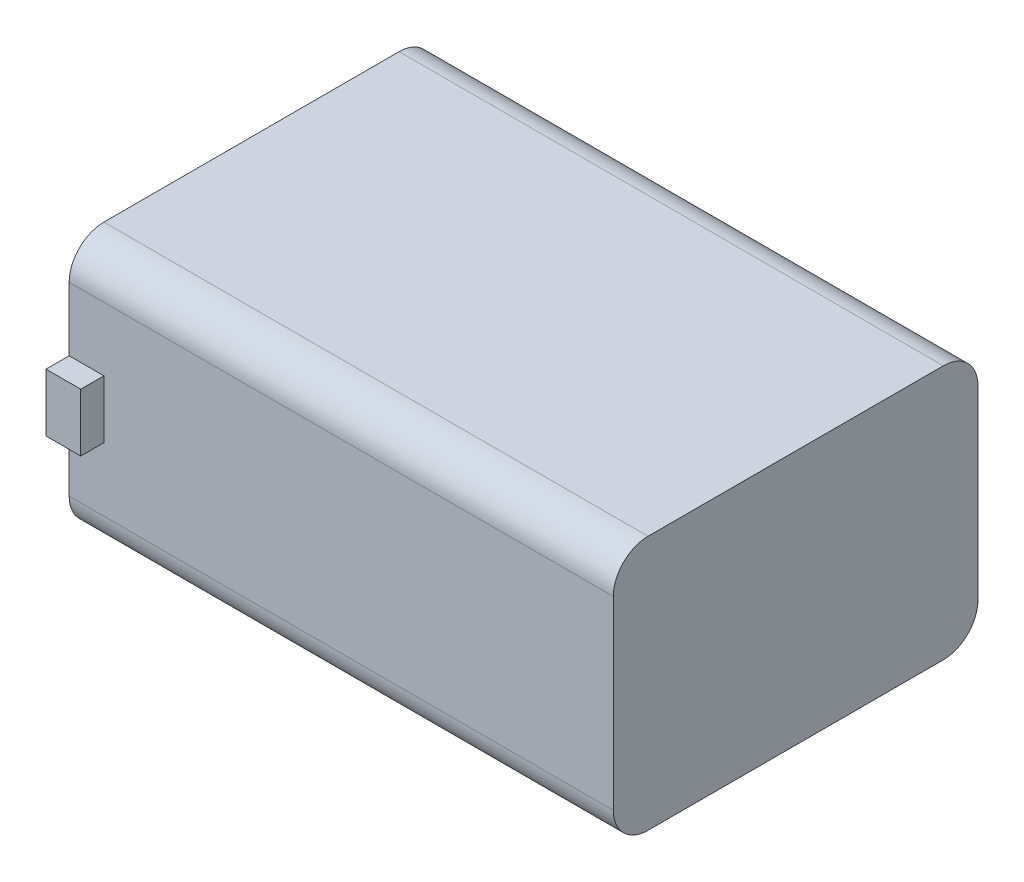
ISO-10303-21;
HEADER;
FILE_DESCRIPTION(('STEP AP214'),'2;1');
FILE_NAME('part.step','',(''),(''),'','','');
FILE_SCHEMA(('AUTOMOTIVE_DESIGN { 1 0 10303 214 1 1 1 1 }'));
ENDSEC;
DATA;
#1=APPLICATION_CONTEXT('core data for automotive mechanical design processes');
#2=APPLICATION_PROTOCOL_DEFINITION('international standard','automotive_design',2000,#1);
#3=PRODUCT_CONTEXT('',#1,'mechanical');
#4=PRODUCT('Part','Part','',(#3));
#5=PRODUCT_RELATED_PRODUCT_CATEGORY('part','',(#4));
#6=PRODUCT_DEFINITION_FORMATION('','',#4);
#7=PRODUCT_DEFINITION_CONTEXT('part definition',#1,'design');
#8=PRODUCT_DEFINITION('design','',#6,#7);
#9=PRODUCT_DEFINITION_SHAPE('','',#8);
#10=(LENGTH_UNIT() NAMED_UNIT(*) SI_UNIT(.MILLI.,.METRE.));
#11=(NAMED_UNIT(*) PLANE_ANGLE_UNIT() SI_UNIT($,.RADIAN.));
#12=(NAMED_UNIT(*) SI_UNIT($,.STERADIAN.) SOLID_ANGLE_UNIT());
#13=UNCERTAINTY_MEASURE_WITH_UNIT(LENGTH_MEASURE(1.E-05),#10,'distance_accuracy_value','');
#14=(GEOMETRIC_REPRESENTATION_CONTEXT(3) GLOBAL_UNCERTAINTY_ASSIGNED_CONTEXT((#13)) GLOBAL_UNIT_ASSIGNED_CONTEXT((#10,
#11,#12)) REPRESENTATION_CONTEXT('',''));
#15=CARTESIAN_POINT('',(0.,0.,0.));
#16=DIRECTION('',(0.,0.,1.));
#17=DIRECTION('',(1.,0.,0.));
#18=AXIS2_PLACEMENT_3D('',#15,#16,#17);
#19=CARTESIAN_POINT('',(23.5,11.,-15.75));
#20=DIRECTION('',(-1.,0.,0.));
#21=DIRECTION('',(0.,0.,1.));
#22=AXIS2_PLACEMENT_3D('',#19,#20,#21);
#23=PLANE('',#22);
#24=DIRECTION('',(0.,0.,-1.));
#25=VECTOR('',#24,1.);
#26=CARTESIAN_POINT('',(23.5,11.,-15.75));
#27=LINE('',#26,#25);
#28=CARTESIAN_POINT('',(23.5,11.,12.75));
#29=VERTEX_POINT('',#28);
#30=CARTESIAN_POINT('',(23.5,11.,-12.75));
#31=VERTEX_POINT('',#30);
#32=EDGE_CURVE('E166',#29,#31,#27,.T.);
#33=ORIENTED_EDGE('',*,*,#32,.F.);
#34=CARTESIAN_POINT('',(23.5,8.,12.75));
#35=DIRECTION('',(-1.,0.,0.));
#36=DIRECTION('',(0.,0.,1.));
#37=AXIS2_PLACEMENT_3D('',#34,#35,#36);
#38=CIRCLE('',#37,3.);
#39=CARTESIAN_POINT('',(23.5,8.,15.75));
#40=VERTEX_POINT('',#39);
#41=EDGE_CURVE('E214',#29,#40,#38,.F.);
#42=ORIENTED_EDGE('',*,*,#41,.T.);
#43=DIRECTION('',(0.,-1.,0.));
#44=VECTOR('',#43,1.);
#45=CARTESIAN_POINT('',(23.5,11.,15.75));
#46=LINE('',#45,#44);
#47=CARTESIAN_POINT('',(23.5,-8.,15.75));
#48=VERTEX_POINT('',#47);
#49=EDGE_CURVE('E175',#40,#48,#46,.T.);
#50=ORIENTED_EDGE('',*,*,#49,.T.);
#51=CARTESIAN_POINT('',(23.5,-8.,12.75));
#52=DIRECTION('',(-1.,0.,0.));
#53=DIRECTION('',(0.,0.,1.));
#54=AXIS2_PLACEMENT_3D('',#51,#52,#53);
#55=CIRCLE('',#54,3.);
#56=CARTESIAN_POINT('',(23.5,-11.,12.75));
#57=VERTEX_POINT('',#56);
#58=EDGE_CURVE('E208',#48,#57,#55,.F.);
#59=ORIENTED_EDGE('',*,*,#58,.T.);
#60=DIRECTION('',(0.,0.,-1.));
#61=VECTOR('',#60,1.);
#62=CARTESIAN_POINT('',(23.5,-11.,-15.75));
#63=LINE('',#62,#61);
#64=CARTESIAN_POINT('',(23.5,-11.,-12.75));
#65=VERTEX_POINT('',#64);
#66=EDGE_CURVE('E164',#57,#65,#63,.T.);
#67=ORIENTED_EDGE('',*,*,#66,.T.);
#68=CARTESIAN_POINT('',(23.5,-8.,-12.75));
#69=DIRECTION('',(-1.,0.,0.));
#70=DIRECTION('',(0.,0.,1.));
#71=AXIS2_PLACEMENT_3D('',#68,#69,#70);
#72=CIRCLE('',#71,3.);
#73=CARTESIAN_POINT('',(23.5,-8.,-15.75));
#74=VERTEX_POINT('',#73);
#75=EDGE_CURVE('E211',#65,#74,#72,.F.);
#76=ORIENTED_EDGE('',*,*,#75,.T.);
#77=DIRECTION('',(0.,-1.,0.));
#78=VECTOR('',#77,1.);
#79=CARTESIAN_POINT('',(23.5,11.,-15.75));
#80=LINE('',#79,#78);
#81=CARTESIAN_POINT('',(23.5,8.,-15.75));
#82=VERTEX_POINT('',#81);
#83=EDGE_CURVE('E193',#82,#74,#80,.T.);
#84=ORIENTED_EDGE('',*,*,#83,.F.);
#85=CARTESIAN_POINT('',(23.5,8.,-12.75));
#86=DIRECTION('',(-1.,0.,0.));
#87=DIRECTION('',(0.,0.,1.));
#88=AXIS2_PLACEMENT_3D('',#85,#86,#87);
#89=CIRCLE('',#88,3.);
#90=EDGE_CURVE('E205',#82,#31,#89,.F.);
#91=ORIENTED_EDGE('',*,*,#90,.T.);
#92=EDGE_LOOP('',(#33,#42,#50,#59,#67,#76,#84,#91));
#93=FACE_BOUND('',#92,.T.);
#94=ADVANCED_FACE('F39',(#93),#23,.F.);
#95=CARTESIAN_POINT('',(-23.5,11.,-15.75));
#96=DIRECTION('',(0.,0.,1.));
#97=DIRECTION('',(1.,0.,0.));
#98=AXIS2_PLACEMENT_3D('',#95,#96,#97);
#99=PLANE('',#98);
#100=ORIENTED_EDGE('',*,*,#83,.T.);
#101=DIRECTION('',(-1.,0.,0.));
#102=VECTOR('',#101,1.);
#103=CARTESIAN_POINT('',(-23.5,-8.,-15.75));
#104=LINE('',#103,#102);
#105=CARTESIAN_POINT('',(-23.5,-8.,-15.75));
#106=VERTEX_POINT('',#105);
#107=EDGE_CURVE('E240',#74,#106,#104,.T.);
#108=ORIENTED_EDGE('',*,*,#107,.T.);
#109=DIRECTION('',(0.,-1.,0.));
#110=VECTOR('',#109,1.);
#111=CARTESIAN_POINT('',(-23.5,11.,-15.75));
#112=LINE('',#111,#110);
#113=CARTESIAN_POINT('',(-23.5,8.,-15.75));
#114=VERTEX_POINT('',#113);
#115=EDGE_CURVE('E189',#114,#106,#112,.T.);
#116=ORIENTED_EDGE('',*,*,#115,.F.);
#117=DIRECTION('',(-1.,0.,0.));
#118=VECTOR('',#117,1.);
#119=CARTESIAN_POINT('',(23.5,8.,-15.75));
#120=LINE('',#119,#118);
#121=EDGE_CURVE('E237',#114,#82,#120,.F.);
#122=ORIENTED_EDGE('',*,*,#121,.T.);
#123=EDGE_LOOP('',(#100,#108,#116,#122));
#124=FACE_BOUND('',#123,.T.);
#125=ADVANCED_FACE('F291',(#124),#99,.F.);
#126=CARTESIAN_POINT('',(-23.5,11.,-15.75));
#127=DIRECTION('',(1.,0.,0.));
#128=DIRECTION('',(0.,0.,-1.));
#129=AXIS2_PLACEMENT_3D('',#126,#127,#128);
#130=PLANE('',#129);
#131=DIRECTION('',(0.,0.,-1.));
#132=VECTOR('',#131,1.);
#133=CARTESIAN_POINT('',(-23.5,2.5,7.75));
#134=LINE('',#133,#132);
#135=CARTESIAN_POINT('',(-23.5,2.5,17.75));
#136=VERTEX_POINT('',#135);
#137=CARTESIAN_POINT('',(-23.5,2.5,15.75));
#138=VERTEX_POINT('',#137);
#139=EDGE_CURVE('E136',#136,#138,#134,.T.);
#140=ORIENTED_EDGE('',*,*,#139,.T.);
#141=DIRECTION('',(0.,-1.,0.));
#142=VECTOR('',#141,1.);
#143=CARTESIAN_POINT('',(-23.5,11.,15.75));
#144=LINE('',#143,#142);
#145=CARTESIAN_POINT('',(-23.5,8.,15.75));
#146=VERTEX_POINT('',#145);
#147=EDGE_CURVE('E186',#146,#138,#144,.T.);
#148=ORIENTED_EDGE('',*,*,#147,.F.);
#149=CARTESIAN_POINT('',(-23.5,8.,12.75));
#150=DIRECTION('',(1.,0.,0.));
#151=DIRECTION('',(0.,0.,-1.));
#152=AXIS2_PLACEMENT_3D('',#149,#150,#151);
#153=CIRCLE('',#152,3.);
#154=CARTESIAN_POINT('',(-23.5,11.,12.75));
#155=VERTEX_POINT('',#154);
#156=EDGE_CURVE('E234',#146,#155,#153,.F.);
#157=ORIENTED_EDGE('',*,*,#156,.T.);
#158=DIRECTION('',(0.,0.,1.));
#159=VECTOR('',#158,1.);
#160=CARTESIAN_POINT('',(-23.5,11.,-15.75));
#161=LINE('',#160,#159);
#162=CARTESIAN_POINT('',(-23.5,11.,-12.75));
#163=VERTEX_POINT('',#162);
#164=EDGE_CURVE('E170',#163,#155,#161,.T.);
#165=ORIENTED_EDGE('',*,*,#164,.F.);
#166=CARTESIAN_POINT('',(-23.5,8.,-12.75));
#167=DIRECTION('',(1.,0.,0.));
#168=DIRECTION('',(0.,0.,-1.));
#169=AXIS2_PLACEMENT_3D('',#166,#167,#168);
#170=CIRCLE('',#169,3.);
#171=EDGE_CURVE('E224',#163,#114,#170,.F.);
#172=ORIENTED_EDGE('',*,*,#171,.T.);
#173=ORIENTED_EDGE('',*,*,#115,.T.);
#174=CARTESIAN_POINT('',(-23.5,-8.,-12.75));
#175=DIRECTION('',(1.,0.,0.));
#176=DIRECTION('',(0.,0.,-1.));
#177=AXIS2_PLACEMENT_3D('',#174,#175,#176);
#178=CIRCLE('',#177,3.);
#179=CARTESIAN_POINT('',(-23.5,-11.,-12.75));
#180=VERTEX_POINT('',#179);
#181=EDGE_CURVE('E231',#106,#180,#178,.F.);
#182=ORIENTED_EDGE('',*,*,#181,.T.);
#183=DIRECTION('',(0.,0.,1.));
#184=VECTOR('',#183,1.);
#185=CARTESIAN_POINT('',(-23.5,-11.,-15.75));
#186=LINE('',#185,#184);
#187=CARTESIAN_POINT('',(-23.5,-11.,12.75));
#188=VERTEX_POINT('',#187);
#189=EDGE_CURVE('E171',#180,#188,#186,.T.);
#190=ORIENTED_EDGE('',*,*,#189,.T.);
#191=CARTESIAN_POINT('',(-23.5,-8.,12.75));
#192=DIRECTION('',(1.,0.,0.));
#193=DIRECTION('',(0.,0.,-1.));
#194=AXIS2_PLACEMENT_3D('',#191,#192,#193);
#195=CIRCLE('',#194,3.);
#196=CARTESIAN_POINT('',(-23.5,-8.,15.75));
#197=VERTEX_POINT('',#196);
#198=EDGE_CURVE('E227',#188,#197,#195,.F.);
#199=ORIENTED_EDGE('',*,*,#198,.T.);
#200=CARTESIAN_POINT('',(-23.5,-2.5,15.75));
#201=VERTEX_POINT('',#200);
#202=EDGE_CURVE('E185',#201,#197,#144,.T.);
#203=ORIENTED_EDGE('',*,*,#202,.F.);
#204=DIRECTION('',(0.,0.,1.));
#205=VECTOR('',#204,1.);
#206=CARTESIAN_POINT('',(-23.5,-2.5,7.75));
#207=LINE('',#206,#205);
#208=CARTESIAN_POINT('',(-23.5,-2.5,17.75));
#209=VERTEX_POINT('',#208);
#210=EDGE_CURVE('E155',#201,#209,#207,.T.);
#211=ORIENTED_EDGE('',*,*,#210,.T.);
#212=DIRECTION('',(0.,1.,0.));
#213=VECTOR('',#212,1.);
#214=CARTESIAN_POINT('',(-23.5,2.5,17.75));
#215=LINE('',#214,#213);
#216=EDGE_CURVE('E143',#209,#136,#215,.T.);
#217=ORIENTED_EDGE('',*,*,#216,.T.);
#218=EDGE_LOOP('',(#140,#148,#157,#165,#172,#173,#182,#190,#199,#203,#211,#217));
#219=FACE_BOUND('',#218,.T.);
#220=ADVANCED_FACE('F254',(#219),#130,.F.);
#221=CARTESIAN_POINT('',(-23.5,11.,15.75));
#222=DIRECTION('',(0.,0.,-1.));
#223=DIRECTION('',(-1.,0.,0.));
#224=AXIS2_PLACEMENT_3D('',#221,#222,#223);
#225=PLANE('',#224);
#226=ORIENTED_EDGE('',*,*,#147,.T.);
#227=DIRECTION('',(1.,0.,0.));
#228=VECTOR('',#227,1.);
#229=CARTESIAN_POINT('',(-23.5,2.5,15.75));
#230=LINE('',#229,#228);
#231=CARTESIAN_POINT('',(-20.5,2.5,15.75));
#232=VERTEX_POINT('',#231);
#233=EDGE_CURVE('E11',#138,#232,#230,.T.);
#234=ORIENTED_EDGE('',*,*,#233,.T.);
#235=DIRECTION('',(0.,1.,0.));
#236=VECTOR('',#235,1.);
#237=CARTESIAN_POINT('',(-20.5,11.,15.75));
#238=LINE('',#237,#236);
#239=CARTESIAN_POINT('',(-20.5,-2.5,15.75));
#240=VERTEX_POINT('',#239);
#241=EDGE_CURVE('E57',#240,#232,#238,.T.);
#242=ORIENTED_EDGE('',*,*,#241,.F.);
#243=DIRECTION('',(-1.,0.,0.));
#244=VECTOR('',#243,1.);
#245=CARTESIAN_POINT('',(-23.5,-2.5,15.75));
#246=LINE('',#245,#244);
#247=EDGE_CURVE('E48',#240,#201,#246,.T.);
#248=ORIENTED_EDGE('',*,*,#247,.T.);
#249=ORIENTED_EDGE('',*,*,#202,.T.);
#250=DIRECTION('',(1.,0.,0.));
#251=VECTOR('',#250,1.);
#252=CARTESIAN_POINT('',(-23.5,-8.,15.75));
#253=LINE('',#252,#251);
#254=EDGE_CURVE('E217',#197,#48,#253,.T.);
#255=ORIENTED_EDGE('',*,*,#254,.T.);
#256=ORIENTED_EDGE('',*,*,#49,.F.);
#257=DIRECTION('',(1.,0.,0.));
#258=VECTOR('',#257,1.);
#259=CARTESIAN_POINT('',(-23.5,8.,15.75));
#260=LINE('',#259,#258);
#261=EDGE_CURVE('E221',#40,#146,#260,.F.);
#262=ORIENTED_EDGE('',*,*,#261,.T.);
#263=EDGE_LOOP('',(#226,#234,#242,#248,#249,#255,#256,#262));
#264=FACE_BOUND('',#263,.T.);
#265=ADVANCED_FACE('F252',(#264),#225,.F.);
#266=CARTESIAN_POINT('',(0.,11.,0.));
#267=DIRECTION('',(0.,1.,0.));
#268=DIRECTION('',(0.,0.,1.));
#269=AXIS2_PLACEMENT_3D('',#266,#267,#268);
#270=PLANE('',#269);
#271=ORIENTED_EDGE('',*,*,#164,.T.);
#272=DIRECTION('',(1.,0.,0.));
#273=VECTOR('',#272,1.);
#274=CARTESIAN_POINT('',(23.5,11.,12.75));
#275=LINE('',#274,#273);
#276=EDGE_CURVE('E201',#155,#29,#275,.T.);
#277=ORIENTED_EDGE('',*,*,#276,.T.);
#278=ORIENTED_EDGE('',*,*,#32,.T.);
#279=DIRECTION('',(-1.,0.,0.));
#280=VECTOR('',#279,1.);
#281=CARTESIAN_POINT('',(-23.5,11.,-12.75));
#282=LINE('',#281,#280);
#283=EDGE_CURVE('E197',#31,#163,#282,.T.);
#284=ORIENTED_EDGE('',*,*,#283,.T.);
#285=EDGE_LOOP('',(#271,#277,#278,#284));
#286=FACE_BOUND('',#285,.T.);
#287=ADVANCED_FACE('F273',(#286),#270,.T.);
#288=CARTESIAN_POINT('',(0.,-11.,0.));
#289=DIRECTION('',(0.,1.,0.));
#290=DIRECTION('',(0.,0.,1.));
#291=AXIS2_PLACEMENT_3D('',#288,#289,#290);
#292=PLANE('',#291);
#293=ORIENTED_EDGE('',*,*,#189,.F.);
#294=DIRECTION('',(-1.,0.,0.));
#295=VECTOR('',#294,1.);
#296=CARTESIAN_POINT('',(0.,-11.,-12.75));
#297=LINE('',#296,#295);
#298=EDGE_CURVE('E247',#180,#65,#297,.F.);
#299=ORIENTED_EDGE('',*,*,#298,.T.);
#300=ORIENTED_EDGE('',*,*,#66,.F.);
#301=DIRECTION('',(1.,0.,0.));
#302=VECTOR('',#301,1.);
#303=CARTESIAN_POINT('',(0.,-11.,12.75));
#304=LINE('',#303,#302);
#305=EDGE_CURVE('E244',#57,#188,#304,.F.);
#306=ORIENTED_EDGE('',*,*,#305,.T.);
#307=EDGE_LOOP('',(#293,#299,#300,#306));
#308=FACE_BOUND('',#307,.T.);
#309=ADVANCED_FACE('F303',(#308),#292,.F.);
#310=CARTESIAN_POINT('',(0.,8.,12.75));
#311=DIRECTION('',(-1.,0.,0.));
#312=DIRECTION('',(0.,0.,1.));
#313=AXIS2_PLACEMENT_3D('',#310,#311,#312);
#314=CYLINDRICAL_SURFACE('',#313,3.);
#315=ORIENTED_EDGE('',*,*,#156,.F.);
#316=ORIENTED_EDGE('',*,*,#261,.F.);
#317=ORIENTED_EDGE('',*,*,#41,.F.);
#318=ORIENTED_EDGE('',*,*,#276,.F.);
#319=EDGE_LOOP('',(#315,#316,#317,#318));
#320=FACE_BOUND('',#319,.T.);
#321=ADVANCED_FACE('F271',(#320),#314,.T.);
#322=CARTESIAN_POINT('',(-23.5,-8.,-12.75));
#323=DIRECTION('',(-1.,0.,0.));
#324=DIRECTION('',(0.,0.,1.));
#325=AXIS2_PLACEMENT_3D('',#322,#323,#324);
#326=CYLINDRICAL_SURFACE('',#325,3.);
#327=ORIENTED_EDGE('',*,*,#75,.F.);
#328=ORIENTED_EDGE('',*,*,#298,.F.);
#329=ORIENTED_EDGE('',*,*,#181,.F.);
#330=ORIENTED_EDGE('',*,*,#107,.F.);
#331=EDGE_LOOP('',(#327,#328,#329,#330));
#332=FACE_BOUND('',#331,.T.);
#333=ADVANCED_FACE('F302',(#332),#326,.T.);
#334=CARTESIAN_POINT('',(-23.5,-8.,12.75));
#335=DIRECTION('',(1.,0.,0.));
#336=DIRECTION('',(0.,0.,-1.));
#337=AXIS2_PLACEMENT_3D('',#334,#335,#336);
#338=CYLINDRICAL_SURFACE('',#337,3.);
#339=ORIENTED_EDGE('',*,*,#198,.F.);
#340=ORIENTED_EDGE('',*,*,#305,.F.);
#341=ORIENTED_EDGE('',*,*,#58,.F.);
#342=ORIENTED_EDGE('',*,*,#254,.F.);
#343=EDGE_LOOP('',(#339,#340,#341,#342));
#344=FACE_BOUND('',#343,.T.);
#345=ADVANCED_FACE('F262',(#344),#338,.T.);
#346=CARTESIAN_POINT('',(0.,8.,-12.75));
#347=DIRECTION('',(1.,0.,0.));
#348=DIRECTION('',(0.,0.,-1.));
#349=AXIS2_PLACEMENT_3D('',#346,#347,#348);
#350=CYLINDRICAL_SURFACE('',#349,3.);
#351=ORIENTED_EDGE('',*,*,#90,.F.);
#352=ORIENTED_EDGE('',*,*,#121,.F.);
#353=ORIENTED_EDGE('',*,*,#171,.F.);
#354=ORIENTED_EDGE('',*,*,#283,.F.);
#355=EDGE_LOOP('',(#351,#352,#353,#354));
#356=FACE_BOUND('',#355,.T.);
#357=ADVANCED_FACE('F41',(#356),#350,.T.);
#358=CARTESIAN_POINT('',(-20.5,2.5,7.75));
#359=DIRECTION('',(0.,1.,0.));
#360=DIRECTION('',(0.,0.,1.));
#361=AXIS2_PLACEMENT_3D('',#358,#359,#360);
#362=PLANE('',#361);
#363=ORIENTED_EDGE('',*,*,#233,.F.);
#364=ORIENTED_EDGE('',*,*,#139,.F.);
#365=DIRECTION('',(-1.,0.,0.));
#366=VECTOR('',#365,1.);
#367=CARTESIAN_POINT('',(-20.5,2.5,17.75));
#368=LINE('',#367,#366);
#369=CARTESIAN_POINT('',(-20.5,2.5,17.75));
#370=VERTEX_POINT('',#369);
#371=EDGE_CURVE('E145',#370,#136,#368,.T.);
#372=ORIENTED_EDGE('',*,*,#371,.F.);
#373=DIRECTION('',(0.,0.,-1.));
#374=VECTOR('',#373,1.);
#375=CARTESIAN_POINT('',(-20.5,2.5,7.75));
#376=LINE('',#375,#374);
#377=EDGE_CURVE('E146',#370,#232,#376,.T.);
#378=ORIENTED_EDGE('',*,*,#377,.T.);
#379=EDGE_LOOP('',(#363,#364,#372,#378));
#380=FACE_BOUND('',#379,.T.);
#381=ADVANCED_FACE('F279',(#380),#362,.T.);
#382=CARTESIAN_POINT('',(-20.5,-2.5,7.75));
#383=DIRECTION('',(0.,-1.,0.));
#384=DIRECTION('',(0.,0.,-1.));
#385=AXIS2_PLACEMENT_3D('',#382,#383,#384);
#386=PLANE('',#385);
#387=ORIENTED_EDGE('',*,*,#247,.F.);
#388=DIRECTION('',(0.,0.,1.));
#389=VECTOR('',#388,1.);
#390=CARTESIAN_POINT('',(-20.5,-2.5,7.75));
#391=LINE('',#390,#389);
#392=CARTESIAN_POINT('',(-20.5,-2.5,17.75));
#393=VERTEX_POINT('',#392);
#394=EDGE_CURVE('E126',#240,#393,#391,.T.);
#395=ORIENTED_EDGE('',*,*,#394,.T.);
#396=DIRECTION('',(-1.,0.,0.));
#397=VECTOR('',#396,1.);
#398=CARTESIAN_POINT('',(-20.5,-2.5,17.75));
#399=LINE('',#398,#397);
#400=EDGE_CURVE('E130',#393,#209,#399,.T.);
#401=ORIENTED_EDGE('',*,*,#400,.T.);
#402=ORIENTED_EDGE('',*,*,#210,.F.);
#403=EDGE_LOOP('',(#387,#395,#401,#402));
#404=FACE_BOUND('',#403,.T.);
#405=ADVANCED_FACE('F128',(#404),#386,.T.);
#406=CARTESIAN_POINT('',(-20.5,0.,0.));
#407=DIRECTION('',(-1.,0.,0.));
#408=DIRECTION('',(0.,0.,1.));
#409=AXIS2_PLACEMENT_3D('',#406,#407,#408);
#410=PLANE('',#409);
#411=ORIENTED_EDGE('',*,*,#394,.F.);
#412=ORIENTED_EDGE('',*,*,#241,.T.);
#413=ORIENTED_EDGE('',*,*,#377,.F.);
#414=DIRECTION('',(0.,1.,0.));
#415=VECTOR('',#414,1.);
#416=CARTESIAN_POINT('',(-20.5,2.5,17.75));
#417=LINE('',#416,#415);
#418=EDGE_CURVE('E135',#393,#370,#417,.T.);
#419=ORIENTED_EDGE('',*,*,#418,.F.);
#420=EDGE_LOOP('',(#411,#412,#413,#419));
#421=FACE_BOUND('',#420,.T.);
#422=ADVANCED_FACE('F148',(#421),#410,.F.);
#423=CARTESIAN_POINT('',(-20.5,2.5,17.75));
#424=DIRECTION('',(0.,0.,1.));
#425=DIRECTION('',(1.,0.,0.));
#426=AXIS2_PLACEMENT_3D('',#423,#424,#425);
#427=PLANE('',#426);
#428=ORIENTED_EDGE('',*,*,#216,.F.);
#429=ORIENTED_EDGE('',*,*,#400,.F.);
#430=ORIENTED_EDGE('',*,*,#418,.T.);
#431=ORIENTED_EDGE('',*,*,#371,.T.);
#432=EDGE_LOOP('',(#428,#429,#430,#431));
#433=FACE_BOUND('',#432,.T.);
#434=ADVANCED_FACE('F140',(#433),#427,.T.);
#435=CLOSED_SHELL('',(#94,#125,#220,#265,#287,#309,#321,#333,#345,#357,#381,#405,#422,#434));
#436=MANIFOLD_SOLID_BREP('B2',#435);
#437=ADVANCED_BREP_SHAPE_REPRESENTATION('',(#18,#436),#14);
#438=SHAPE_DEFINITION_REPRESENTATION(#9,#437);
ENDSEC;
END-ISO-10303-21;
